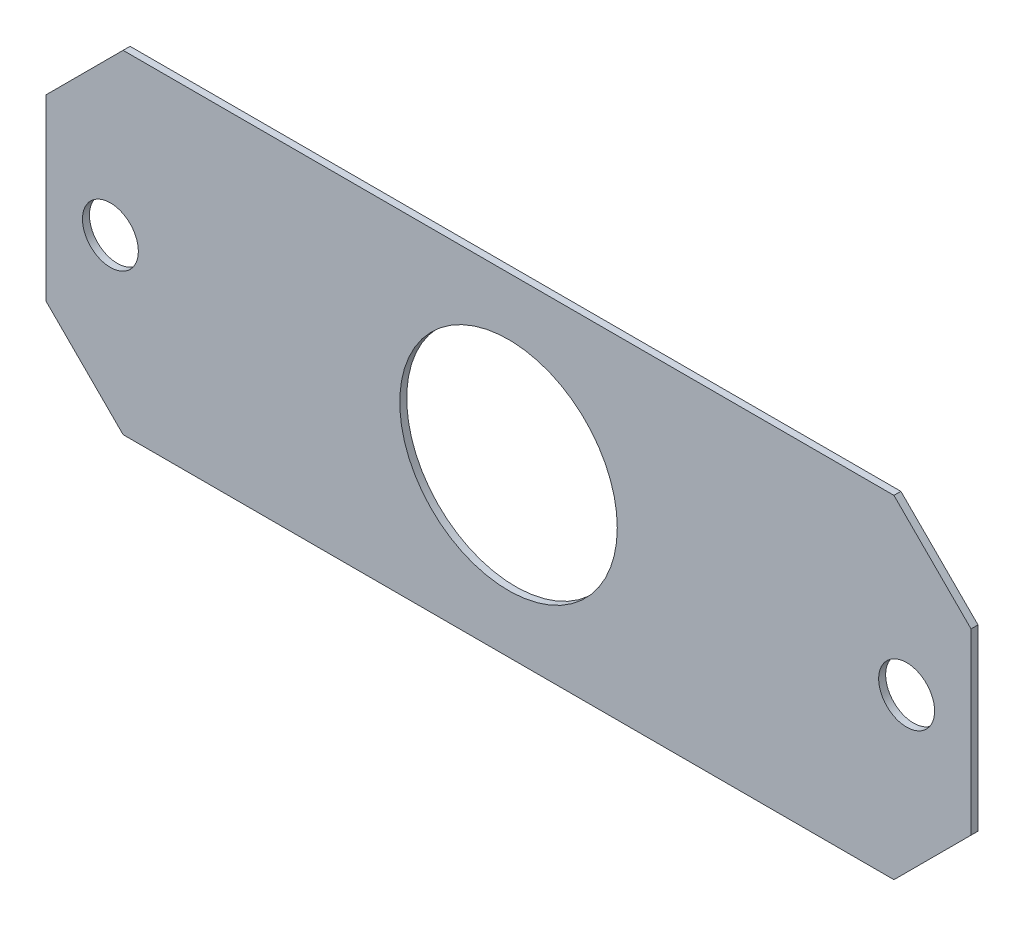
ISO-10303-21;
HEADER;
FILE_DESCRIPTION(('STEP AP214'),'2;1');
FILE_NAME('part.step','',(''),(''),'','','');
FILE_SCHEMA(('AUTOMOTIVE_DESIGN { 1 0 10303 214 1 1 1 1 }'));
ENDSEC;
DATA;
#1=APPLICATION_CONTEXT('core data for automotive mechanical design processes');
#2=APPLICATION_PROTOCOL_DEFINITION('international standard','automotive_design',2000,#1);
#3=PRODUCT_CONTEXT('',#1,'mechanical');
#4=PRODUCT('Part','Part','',(#3));
#5=PRODUCT_RELATED_PRODUCT_CATEGORY('part','',(#4));
#6=PRODUCT_DEFINITION_FORMATION('','',#4);
#7=PRODUCT_DEFINITION_CONTEXT('part definition',#1,'design');
#8=PRODUCT_DEFINITION('design','',#6,#7);
#9=PRODUCT_DEFINITION_SHAPE('','',#8);
#10=(LENGTH_UNIT() NAMED_UNIT(*) SI_UNIT(.MILLI.,.METRE.));
#11=(NAMED_UNIT(*) PLANE_ANGLE_UNIT() SI_UNIT($,.RADIAN.));
#12=(NAMED_UNIT(*) SI_UNIT($,.STERADIAN.) SOLID_ANGLE_UNIT());
#13=UNCERTAINTY_MEASURE_WITH_UNIT(LENGTH_MEASURE(1.E-05),#10,'distance_accuracy_value','');
#14=(GEOMETRIC_REPRESENTATION_CONTEXT(3) GLOBAL_UNCERTAINTY_ASSIGNED_CONTEXT((#13)) GLOBAL_UNIT_ASSIGNED_CONTEXT((#10,
#11,#12)) REPRESENTATION_CONTEXT('',''));
#15=CARTESIAN_POINT('',(0.,0.,0.));
#16=DIRECTION('',(0.,0.,1.));
#17=DIRECTION('',(1.,0.,0.));
#18=AXIS2_PLACEMENT_3D('',#15,#16,#17);
#19=CARTESIAN_POINT('',(-22.4995328850521,9.7155,0.4064));
#20=DIRECTION('',(0.,-1.,0.));
#21=DIRECTION('',(0.,0.,-1.));
#22=AXIS2_PLACEMENT_3D('',#19,#20,#21);
#23=PLANE('',#22);
#24=DIRECTION('',(-1.,0.,0.));
#25=VECTOR('',#24,1.);
#26=CARTESIAN_POINT('',(-22.4995328850521,9.7155,0.));
#27=LINE('',#26,#25);
#28=CARTESIAN_POINT('',(22.4995328850521,9.7155,0.));
#29=VERTEX_POINT('',#28);
#30=CARTESIAN_POINT('',(-22.4995328850521,9.7155,0.));
#31=VERTEX_POINT('',#30);
#32=EDGE_CURVE('E134',#29,#31,#27,.T.);
#33=ORIENTED_EDGE('',*,*,#32,.T.);
#34=DIRECTION('',(0.,0.,-1.));
#35=VECTOR('',#34,1.);
#36=CARTESIAN_POINT('',(-22.4995328850521,9.7155,0.4064));
#37=LINE('',#36,#35);
#38=CARTESIAN_POINT('',(-22.4995328850521,9.7155,0.4064));
#39=VERTEX_POINT('',#38);
#40=EDGE_CURVE('E11',#39,#31,#37,.T.);
#41=ORIENTED_EDGE('',*,*,#40,.F.);
#42=DIRECTION('',(-1.,0.,0.));
#43=VECTOR('',#42,1.);
#44=CARTESIAN_POINT('',(-22.4995328850521,9.7155,0.4064));
#45=LINE('',#44,#43);
#46=CARTESIAN_POINT('',(22.4995328850521,9.7155,0.4064));
#47=VERTEX_POINT('',#46);
#48=EDGE_CURVE('E149',#47,#39,#45,.T.);
#49=ORIENTED_EDGE('',*,*,#48,.F.);
#50=DIRECTION('',(0.,0.,-1.));
#51=VECTOR('',#50,1.);
#52=CARTESIAN_POINT('',(22.4995328850521,9.7155,0.4064));
#53=LINE('',#52,#51);
#54=EDGE_CURVE('E130',#47,#29,#53,.T.);
#55=ORIENTED_EDGE('',*,*,#54,.T.);
#56=EDGE_LOOP('',(#33,#41,#49,#55));
#57=FACE_BOUND('',#56,.T.);
#58=ADVANCED_FACE('F38',(#57),#23,.F.);
#59=CARTESIAN_POINT('',(-27.0002,5.21483288505213,0.4064));
#60=DIRECTION('',(0.707106781186548,-0.707106781186548,0.));
#61=DIRECTION('',(0.707106781186548,0.707106781186548,0.));
#62=AXIS2_PLACEMENT_3D('',#59,#60,#61);
#63=PLANE('',#62);
#64=DIRECTION('',(-0.707106781186548,-0.707106781186548,0.));
#65=VECTOR('',#64,1.);
#66=CARTESIAN_POINT('',(-27.0002,5.21483288505213,0.));
#67=LINE('',#66,#65);
#68=CARTESIAN_POINT('',(-27.0002,5.21483288505213,0.));
#69=VERTEX_POINT('',#68);
#70=EDGE_CURVE('E137',#31,#69,#67,.T.);
#71=ORIENTED_EDGE('',*,*,#70,.T.);
#72=DIRECTION('',(0.,0.,-1.));
#73=VECTOR('',#72,1.);
#74=CARTESIAN_POINT('',(-27.0002,5.21483288505213,0.4064));
#75=LINE('',#74,#73);
#76=CARTESIAN_POINT('',(-27.0002,5.21483288505213,0.4064));
#77=VERTEX_POINT('',#76);
#78=EDGE_CURVE('E46',#77,#69,#75,.T.);
#79=ORIENTED_EDGE('',*,*,#78,.F.);
#80=DIRECTION('',(-0.707106781186548,-0.707106781186548,0.));
#81=VECTOR('',#80,1.);
#82=CARTESIAN_POINT('',(-27.0002,5.21483288505213,0.4064));
#83=LINE('',#82,#81);
#84=EDGE_CURVE('E97',#39,#77,#83,.T.);
#85=ORIENTED_EDGE('',*,*,#84,.F.);
#86=ORIENTED_EDGE('',*,*,#40,.T.);
#87=EDGE_LOOP('',(#71,#79,#85,#86));
#88=FACE_BOUND('',#87,.T.);
#89=ADVANCED_FACE('F230',(#88),#63,.F.);
#90=CARTESIAN_POINT('',(-27.0002,-5.21483288505213,0.4064));
#91=DIRECTION('',(1.,0.,0.));
#92=DIRECTION('',(0.,0.,-1.));
#93=AXIS2_PLACEMENT_3D('',#90,#91,#92);
#94=PLANE('',#93);
#95=DIRECTION('',(0.,-1.,0.));
#96=VECTOR('',#95,1.);
#97=CARTESIAN_POINT('',(-27.0002,-5.21483288505213,0.));
#98=LINE('',#97,#96);
#99=CARTESIAN_POINT('',(-27.0002,-5.21483288505213,0.));
#100=VERTEX_POINT('',#99);
#101=EDGE_CURVE('E140',#69,#100,#98,.T.);
#102=ORIENTED_EDGE('',*,*,#101,.T.);
#103=DIRECTION('',(0.,0.,-1.));
#104=VECTOR('',#103,1.);
#105=CARTESIAN_POINT('',(-27.0002,-5.21483288505213,0.4064));
#106=LINE('',#105,#104);
#107=CARTESIAN_POINT('',(-27.0002,-5.21483288505213,0.4064));
#108=VERTEX_POINT('',#107);
#109=EDGE_CURVE('E156',#108,#100,#106,.T.);
#110=ORIENTED_EDGE('',*,*,#109,.F.);
#111=DIRECTION('',(0.,-1.,0.));
#112=VECTOR('',#111,1.);
#113=CARTESIAN_POINT('',(-27.0002,-5.21483288505213,0.4064));
#114=LINE('',#113,#112);
#115=EDGE_CURVE('E164',#77,#108,#114,.T.);
#116=ORIENTED_EDGE('',*,*,#115,.F.);
#117=ORIENTED_EDGE('',*,*,#78,.T.);
#118=EDGE_LOOP('',(#102,#110,#116,#117));
#119=FACE_BOUND('',#118,.T.);
#120=ADVANCED_FACE('F162',(#119),#94,.F.);
#121=CARTESIAN_POINT('',(-22.4995328850521,-9.7155,0.4064));
#122=DIRECTION('',(0.707106781186548,0.707106781186548,0.));
#123=DIRECTION('',(-0.707106781186548,0.707106781186548,0.));
#124=AXIS2_PLACEMENT_3D('',#121,#122,#123);
#125=PLANE('',#124);
#126=DIRECTION('',(0.707106781186548,-0.707106781186548,0.));
#127=VECTOR('',#126,1.);
#128=CARTESIAN_POINT('',(-22.4995328850521,-9.7155,0.));
#129=LINE('',#128,#127);
#130=CARTESIAN_POINT('',(-22.4995328850521,-9.7155,0.));
#131=VERTEX_POINT('',#130);
#132=EDGE_CURVE('E142',#100,#131,#129,.T.);
#133=ORIENTED_EDGE('',*,*,#132,.T.);
#134=DIRECTION('',(0.,0.,-1.));
#135=VECTOR('',#134,1.);
#136=CARTESIAN_POINT('',(-22.4995328850521,-9.7155,0.4064));
#137=LINE('',#136,#135);
#138=CARTESIAN_POINT('',(-22.4995328850521,-9.7155,0.4064));
#139=VERTEX_POINT('',#138);
#140=EDGE_CURVE('E153',#139,#131,#137,.T.);
#141=ORIENTED_EDGE('',*,*,#140,.F.);
#142=DIRECTION('',(0.707106781186548,-0.707106781186548,0.));
#143=VECTOR('',#142,1.);
#144=CARTESIAN_POINT('',(-22.4995328850521,-9.7155,0.4064));
#145=LINE('',#144,#143);
#146=EDGE_CURVE('E176',#108,#139,#145,.T.);
#147=ORIENTED_EDGE('',*,*,#146,.F.);
#148=ORIENTED_EDGE('',*,*,#109,.T.);
#149=EDGE_LOOP('',(#133,#141,#147,#148));
#150=FACE_BOUND('',#149,.T.);
#151=ADVANCED_FACE('F172',(#150),#125,.F.);
#152=CARTESIAN_POINT('',(22.4995328850521,-9.7155,0.4064));
#153=DIRECTION('',(0.,1.,0.));
#154=DIRECTION('',(0.,0.,1.));
#155=AXIS2_PLACEMENT_3D('',#152,#153,#154);
#156=PLANE('',#155);
#157=DIRECTION('',(1.,0.,0.));
#158=VECTOR('',#157,1.);
#159=CARTESIAN_POINT('',(22.4995328850521,-9.7155,0.));
#160=LINE('',#159,#158);
#161=CARTESIAN_POINT('',(22.4995328850521,-9.7155,0.));
#162=VERTEX_POINT('',#161);
#163=EDGE_CURVE('E144',#131,#162,#160,.T.);
#164=ORIENTED_EDGE('',*,*,#163,.T.);
#165=DIRECTION('',(0.,0.,-1.));
#166=VECTOR('',#165,1.);
#167=CARTESIAN_POINT('',(22.4995328850521,-9.7155,0.4064));
#168=LINE('',#167,#166);
#169=CARTESIAN_POINT('',(22.4995328850521,-9.7155,0.4064));
#170=VERTEX_POINT('',#169);
#171=EDGE_CURVE('E125',#170,#162,#168,.T.);
#172=ORIENTED_EDGE('',*,*,#171,.F.);
#173=DIRECTION('',(1.,0.,0.));
#174=VECTOR('',#173,1.);
#175=CARTESIAN_POINT('',(22.4995328850521,-9.7155,0.4064));
#176=LINE('',#175,#174);
#177=EDGE_CURVE('E116',#139,#170,#176,.T.);
#178=ORIENTED_EDGE('',*,*,#177,.F.);
#179=ORIENTED_EDGE('',*,*,#140,.T.);
#180=EDGE_LOOP('',(#164,#172,#178,#179));
#181=FACE_BOUND('',#180,.T.);
#182=ADVANCED_FACE('F175',(#181),#156,.F.);
#183=CARTESIAN_POINT('',(27.0002,-5.21483288505213,0.4064));
#184=DIRECTION('',(-0.707106781186547,0.707106781186548,0.));
#185=DIRECTION('',(-0.707106781186548,-0.707106781186547,0.));
#186=AXIS2_PLACEMENT_3D('',#183,#184,#185);
#187=PLANE('',#186);
#188=DIRECTION('',(0.707106781186548,0.707106781186547,0.));
#189=VECTOR('',#188,1.);
#190=CARTESIAN_POINT('',(27.0002,-5.21483288505213,0.));
#191=LINE('',#190,#189);
#192=CARTESIAN_POINT('',(27.0002,-5.21483288505213,0.));
#193=VERTEX_POINT('',#192);
#194=EDGE_CURVE('E124',#162,#193,#191,.T.);
#195=ORIENTED_EDGE('',*,*,#194,.T.);
#196=DIRECTION('',(0.,0.,-1.));
#197=VECTOR('',#196,1.);
#198=CARTESIAN_POINT('',(27.0002,-5.21483288505213,0.4064));
#199=LINE('',#198,#197);
#200=CARTESIAN_POINT('',(27.0002,-5.21483288505213,0.4064));
#201=VERTEX_POINT('',#200);
#202=EDGE_CURVE('E121',#201,#193,#199,.T.);
#203=ORIENTED_EDGE('',*,*,#202,.F.);
#204=DIRECTION('',(0.707106781186548,0.707106781186547,0.));
#205=VECTOR('',#204,1.);
#206=CARTESIAN_POINT('',(27.0002,-5.21483288505213,0.4064));
#207=LINE('',#206,#205);
#208=EDGE_CURVE('E110',#170,#201,#207,.T.);
#209=ORIENTED_EDGE('',*,*,#208,.F.);
#210=ORIENTED_EDGE('',*,*,#171,.T.);
#211=EDGE_LOOP('',(#195,#203,#209,#210));
#212=FACE_BOUND('',#211,.T.);
#213=ADVANCED_FACE('F122',(#212),#187,.F.);
#214=CARTESIAN_POINT('',(27.0002,5.21483288505213,0.4064));
#215=DIRECTION('',(-1.,0.,0.));
#216=DIRECTION('',(0.,0.,1.));
#217=AXIS2_PLACEMENT_3D('',#214,#215,#216);
#218=PLANE('',#217);
#219=DIRECTION('',(0.,1.,0.));
#220=VECTOR('',#219,1.);
#221=CARTESIAN_POINT('',(27.0002,5.21483288505213,0.));
#222=LINE('',#221,#220);
#223=CARTESIAN_POINT('',(27.0002,5.21483288505213,0.));
#224=VERTEX_POINT('',#223);
#225=EDGE_CURVE('E83',#193,#224,#222,.T.);
#226=ORIENTED_EDGE('',*,*,#225,.T.);
#227=DIRECTION('',(0.,0.,-1.));
#228=VECTOR('',#227,1.);
#229=CARTESIAN_POINT('',(27.0002,5.21483288505213,0.4064));
#230=LINE('',#229,#228);
#231=CARTESIAN_POINT('',(27.0002,5.21483288505213,0.4064));
#232=VERTEX_POINT('',#231);
#233=EDGE_CURVE('E126',#232,#224,#230,.T.);
#234=ORIENTED_EDGE('',*,*,#233,.F.);
#235=DIRECTION('',(0.,1.,0.));
#236=VECTOR('',#235,1.);
#237=CARTESIAN_POINT('',(27.0002,5.21483288505213,0.4064));
#238=LINE('',#237,#236);
#239=EDGE_CURVE('E114',#201,#232,#238,.T.);
#240=ORIENTED_EDGE('',*,*,#239,.F.);
#241=ORIENTED_EDGE('',*,*,#202,.T.);
#242=EDGE_LOOP('',(#226,#234,#240,#241));
#243=FACE_BOUND('',#242,.T.);
#244=ADVANCED_FACE('F128',(#243),#218,.F.);
#245=CARTESIAN_POINT('',(22.4995328850521,9.7155,0.4064));
#246=DIRECTION('',(-0.707106781186547,-0.707106781186548,0.));
#247=DIRECTION('',(0.707106781186548,-0.707106781186547,0.));
#248=AXIS2_PLACEMENT_3D('',#245,#246,#247);
#249=PLANE('',#248);
#250=DIRECTION('',(-0.707106781186548,0.707106781186547,0.));
#251=VECTOR('',#250,1.);
#252=CARTESIAN_POINT('',(22.4995328850521,9.7155,0.));
#253=LINE('',#252,#251);
#254=EDGE_CURVE('E89',#224,#29,#253,.T.);
#255=ORIENTED_EDGE('',*,*,#254,.T.);
#256=ORIENTED_EDGE('',*,*,#54,.F.);
#257=DIRECTION('',(-0.707106781186548,0.707106781186547,0.));
#258=VECTOR('',#257,1.);
#259=CARTESIAN_POINT('',(22.4995328850521,9.7155,0.4064));
#260=LINE('',#259,#258);
#261=EDGE_CURVE('E54',#232,#47,#260,.T.);
#262=ORIENTED_EDGE('',*,*,#261,.F.);
#263=ORIENTED_EDGE('',*,*,#233,.T.);
#264=EDGE_LOOP('',(#255,#256,#262,#263));
#265=FACE_BOUND('',#264,.T.);
#266=ADVANCED_FACE('F211',(#265),#249,.F.);
#267=CARTESIAN_POINT('',(0.,0.,0.4064));
#268=DIRECTION('',(0.,0.,-1.));
#269=DIRECTION('',(-1.,0.,0.));
#270=AXIS2_PLACEMENT_3D('',#267,#268,#269);
#271=PLANE('',#270);
#272=CARTESIAN_POINT('',(0.,0.,0.4064));
#273=DIRECTION('',(0.,0.,1.));
#274=DIRECTION('',(1.,0.,0.));
#275=AXIS2_PLACEMENT_3D('',#272,#273,#274);
#276=CIRCLE('',#275,6.35);
#277=CARTESIAN_POINT('',(6.35,0.,0.4064));
#278=VERTEX_POINT('',#277);
#279=EDGE_CURVE('E194',#278,#278,#276,.T.);
#280=ORIENTED_EDGE('',*,*,#279,.F.);
#281=EDGE_LOOP('',(#280));
#282=FACE_BOUND('',#281,.T.);
#283=CARTESIAN_POINT('',(-23.241,0.,0.4064));
#284=DIRECTION('',(0.,0.,1.));
#285=DIRECTION('',(1.,0.,0.));
#286=AXIS2_PLACEMENT_3D('',#283,#284,#285);
#287=CIRCLE('',#286,1.63195);
#288=CARTESIAN_POINT('',(-21.60905,0.,0.4064));
#289=VERTEX_POINT('',#288);
#290=EDGE_CURVE('E190',#289,#289,#287,.T.);
#291=ORIENTED_EDGE('',*,*,#290,.F.);
#292=EDGE_LOOP('',(#291));
#293=FACE_BOUND('',#292,.T.);
#294=CARTESIAN_POINT('',(23.241,0.,0.4064));
#295=DIRECTION('',(0.,0.,1.));
#296=DIRECTION('',(1.,0.,0.));
#297=AXIS2_PLACEMENT_3D('',#294,#295,#296);
#298=CIRCLE('',#297,1.63195);
#299=CARTESIAN_POINT('',(24.87295,0.,0.4064));
#300=VERTEX_POINT('',#299);
#301=EDGE_CURVE('E184',#300,#300,#298,.T.);
#302=ORIENTED_EDGE('',*,*,#301,.F.);
#303=EDGE_LOOP('',(#302));
#304=FACE_BOUND('',#303,.T.);
#305=ORIENTED_EDGE('',*,*,#48,.T.);
#306=ORIENTED_EDGE('',*,*,#84,.T.);
#307=ORIENTED_EDGE('',*,*,#115,.T.);
#308=ORIENTED_EDGE('',*,*,#146,.T.);
#309=ORIENTED_EDGE('',*,*,#177,.T.);
#310=ORIENTED_EDGE('',*,*,#208,.T.);
#311=ORIENTED_EDGE('',*,*,#239,.T.);
#312=ORIENTED_EDGE('',*,*,#261,.T.);
#313=EDGE_LOOP('',(#305,#306,#307,#308,#309,#310,#311,#312));
#314=FACE_BOUND('',#313,.T.);
#315=ADVANCED_FACE('F112',(#282,#293,#304,#314),#271,.F.);
#316=CARTESIAN_POINT('',(0.,0.,0.));
#317=DIRECTION('',(0.,0.,-1.));
#318=DIRECTION('',(-1.,0.,0.));
#319=AXIS2_PLACEMENT_3D('',#316,#317,#318);
#320=PLANE('',#319);
#321=CARTESIAN_POINT('',(0.,0.,0.));
#322=DIRECTION('',(0.,0.,1.));
#323=DIRECTION('',(1.,0.,0.));
#324=AXIS2_PLACEMENT_3D('',#321,#322,#323);
#325=CIRCLE('',#324,6.35);
#326=CARTESIAN_POINT('',(6.35,0.,0.));
#327=VERTEX_POINT('',#326);
#328=EDGE_CURVE('E193',#327,#327,#325,.T.);
#329=ORIENTED_EDGE('',*,*,#328,.T.);
#330=EDGE_LOOP('',(#329));
#331=FACE_BOUND('',#330,.T.);
#332=CARTESIAN_POINT('',(-23.241,0.,0.));
#333=DIRECTION('',(0.,0.,1.));
#334=DIRECTION('',(1.,0.,0.));
#335=AXIS2_PLACEMENT_3D('',#332,#333,#334);
#336=CIRCLE('',#335,1.63195);
#337=CARTESIAN_POINT('',(-21.60905,0.,0.));
#338=VERTEX_POINT('',#337);
#339=EDGE_CURVE('E187',#338,#338,#336,.T.);
#340=ORIENTED_EDGE('',*,*,#339,.T.);
#341=EDGE_LOOP('',(#340));
#342=FACE_BOUND('',#341,.T.);
#343=CARTESIAN_POINT('',(23.241,0.,0.));
#344=DIRECTION('',(0.,0.,1.));
#345=DIRECTION('',(1.,0.,0.));
#346=AXIS2_PLACEMENT_3D('',#343,#344,#345);
#347=CIRCLE('',#346,1.63195);
#348=CARTESIAN_POINT('',(24.87295,0.,0.));
#349=VERTEX_POINT('',#348);
#350=EDGE_CURVE('E138',#349,#349,#347,.T.);
#351=ORIENTED_EDGE('',*,*,#350,.T.);
#352=EDGE_LOOP('',(#351));
#353=FACE_BOUND('',#352,.T.);
#354=ORIENTED_EDGE('',*,*,#32,.F.);
#355=ORIENTED_EDGE('',*,*,#254,.F.);
#356=ORIENTED_EDGE('',*,*,#225,.F.);
#357=ORIENTED_EDGE('',*,*,#194,.F.);
#358=ORIENTED_EDGE('',*,*,#163,.F.);
#359=ORIENTED_EDGE('',*,*,#132,.F.);
#360=ORIENTED_EDGE('',*,*,#101,.F.);
#361=ORIENTED_EDGE('',*,*,#70,.F.);
#362=EDGE_LOOP('',(#354,#355,#356,#357,#358,#359,#360,#361));
#363=FACE_BOUND('',#362,.T.);
#364=ADVANCED_FACE('F168',(#331,#342,#353,#363),#320,.T.);
#365=CARTESIAN_POINT('',(23.241,0.,0.4064));
#366=DIRECTION('',(0.,0.,1.));
#367=DIRECTION('',(1.,0.,0.));
#368=AXIS2_PLACEMENT_3D('',#365,#366,#367);
#369=CYLINDRICAL_SURFACE('',#368,1.63195);
#370=ORIENTED_EDGE('',*,*,#350,.F.);
#371=EDGE_LOOP('',(#370));
#372=FACE_BOUND('',#371,.T.);
#373=ORIENTED_EDGE('',*,*,#301,.T.);
#374=EDGE_LOOP('',(#373));
#375=FACE_BOUND('',#374,.T.);
#376=ADVANCED_FACE('F217',(#372,#375),#369,.F.);
#377=CARTESIAN_POINT('',(-23.241,0.,0.4064));
#378=DIRECTION('',(0.,0.,1.));
#379=DIRECTION('',(1.,0.,0.));
#380=AXIS2_PLACEMENT_3D('',#377,#378,#379);
#381=CYLINDRICAL_SURFACE('',#380,1.63195);
#382=ORIENTED_EDGE('',*,*,#339,.F.);
#383=EDGE_LOOP('',(#382));
#384=FACE_BOUND('',#383,.T.);
#385=ORIENTED_EDGE('',*,*,#290,.T.);
#386=EDGE_LOOP('',(#385));
#387=FACE_BOUND('',#386,.T.);
#388=ADVANCED_FACE('F205',(#384,#387),#381,.F.);
#389=CARTESIAN_POINT('',(0.,0.,0.));
#390=DIRECTION('',(0.,0.,1.));
#391=DIRECTION('',(1.,0.,0.));
#392=AXIS2_PLACEMENT_3D('',#389,#390,#391);
#393=CYLINDRICAL_SURFACE('',#392,6.35);
#394=ORIENTED_EDGE('',*,*,#328,.F.);
#395=EDGE_LOOP('',(#394));
#396=FACE_BOUND('',#395,.T.);
#397=ORIENTED_EDGE('',*,*,#279,.T.);
#398=EDGE_LOOP('',(#397));
#399=FACE_BOUND('',#398,.T.);
#400=ADVANCED_FACE('F202',(#396,#399),#393,.F.);
#401=CLOSED_SHELL('',(#58,#89,#120,#151,#182,#213,#244,#266,#315,#364,#376,#388,#400));
#402=MANIFOLD_SOLID_BREP('B2',#401);
#403=ADVANCED_BREP_SHAPE_REPRESENTATION('',(#18,#402),#14);
#404=SHAPE_DEFINITION_REPRESENTATION(#9,#403);
ENDSEC;
END-ISO-10303-21;
